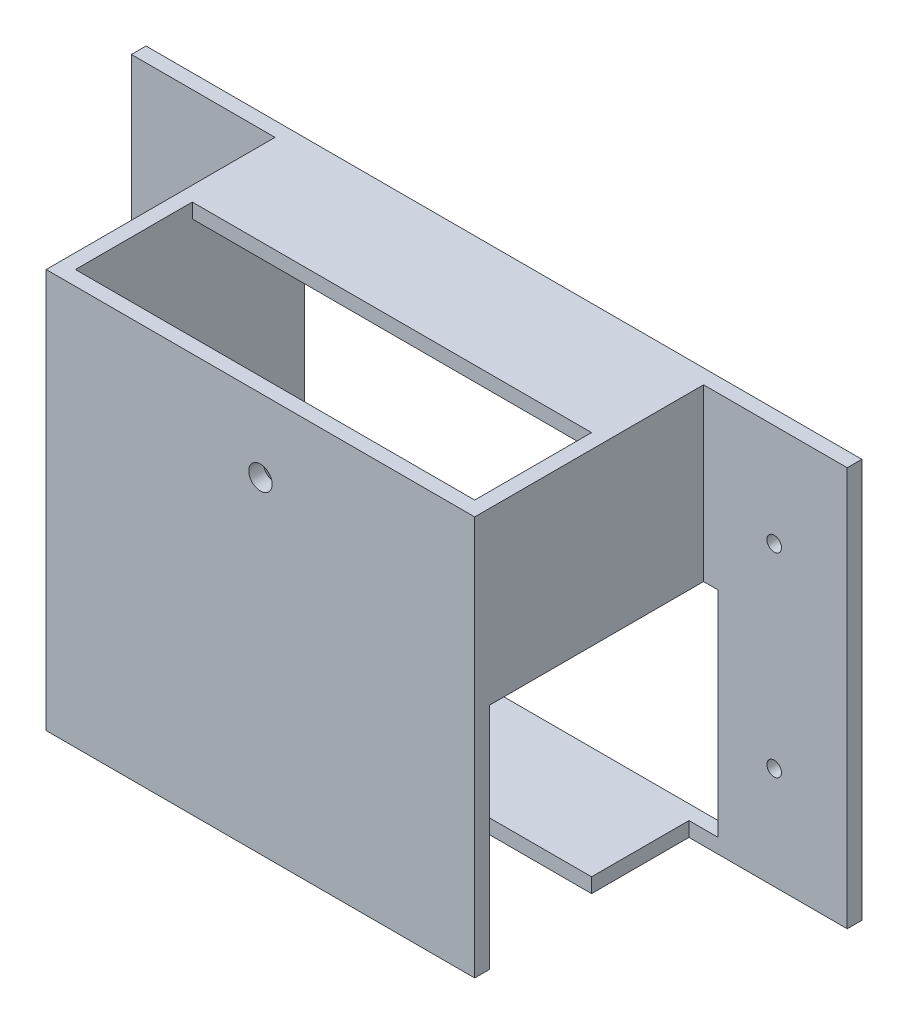
ISO-10303-21;
HEADER;
FILE_DESCRIPTION(('STEP AP214'),'2;1');
FILE_NAME('part.step','',(''),(''),'','','');
FILE_SCHEMA(('AUTOMOTIVE_DESIGN { 1 0 10303 214 1 1 1 1 }'));
ENDSEC;
DATA;
#1=APPLICATION_CONTEXT('core data for automotive mechanical design processes');
#2=APPLICATION_PROTOCOL_DEFINITION('international standard','automotive_design',2000,#1);
#3=PRODUCT_CONTEXT('',#1,'mechanical');
#4=PRODUCT('Part','Part','',(#3));
#5=PRODUCT_RELATED_PRODUCT_CATEGORY('part','',(#4));
#6=PRODUCT_DEFINITION_FORMATION('','',#4);
#7=PRODUCT_DEFINITION_CONTEXT('part definition',#1,'design');
#8=PRODUCT_DEFINITION('design','',#6,#7);
#9=PRODUCT_DEFINITION_SHAPE('','',#8);
#10=(LENGTH_UNIT() NAMED_UNIT(*) SI_UNIT(.MILLI.,.METRE.));
#11=(NAMED_UNIT(*) PLANE_ANGLE_UNIT() SI_UNIT($,.RADIAN.));
#12=(NAMED_UNIT(*) SI_UNIT($,.STERADIAN.) SOLID_ANGLE_UNIT());
#13=UNCERTAINTY_MEASURE_WITH_UNIT(LENGTH_MEASURE(1.E-05),#10,'distance_accuracy_value','');
#14=(GEOMETRIC_REPRESENTATION_CONTEXT(3) GLOBAL_UNCERTAINTY_ASSIGNED_CONTEXT((#13)) GLOBAL_UNIT_ASSIGNED_CONTEXT((#10,
#11,#12)) REPRESENTATION_CONTEXT('',''));
#15=CARTESIAN_POINT('',(0.,0.,0.));
#16=DIRECTION('',(0.,0.,1.));
#17=DIRECTION('',(1.,0.,0.));
#18=AXIS2_PLACEMENT_3D('',#15,#16,#17);
#19=CARTESIAN_POINT('',(68.5398773006135,39.0046012269939,50.));
#20=DIRECTION('',(-1.,0.,0.));
#21=DIRECTION('',(0.,-1.,0.));
#22=AXIS2_PLACEMENT_3D('',#19,#20,#21);
#23=PLANE('',#22);
#24=DIRECTION('',(0.,1.,0.));
#25=VECTOR('',#24,1.);
#26=CARTESIAN_POINT('',(68.5398773006136,-42.9953987730062,3.00000000000002));
#27=LINE('',#26,#25);
#28=CARTESIAN_POINT('',(68.5398773006136,-42.9953987730062,3.00000000000002));
#29=VERTEX_POINT('',#28);
#30=CARTESIAN_POINT('',(68.5398773006136,39.0046012269939,3.00000000000002));
#31=VERTEX_POINT('',#30);
#32=EDGE_CURVE('E209',#29,#31,#27,.T.);
#33=ORIENTED_EDGE('',*,*,#32,.F.);
#34=DIRECTION('',(0.,0.,-1.));
#35=VECTOR('',#34,1.);
#36=CARTESIAN_POINT('',(68.5398773006136,-42.9953987730062,50.));
#37=LINE('',#36,#35);
#38=CARTESIAN_POINT('',(68.5398773006136,-42.9953987730062,0.));
#39=VERTEX_POINT('',#38);
#40=EDGE_CURVE('E264',#29,#39,#37,.T.);
#41=ORIENTED_EDGE('',*,*,#40,.T.);
#42=DIRECTION('',(0.,1.,0.));
#43=VECTOR('',#42,1.);
#44=CARTESIAN_POINT('',(68.5398773006135,39.0046012269939,0.));
#45=LINE('',#44,#43);
#46=CARTESIAN_POINT('',(68.5398773006135,39.0046012269939,0.));
#47=VERTEX_POINT('',#46);
#48=EDGE_CURVE('E256',#39,#47,#45,.T.);
#49=ORIENTED_EDGE('',*,*,#48,.T.);
#50=DIRECTION('',(0.,0.,-1.));
#51=VECTOR('',#50,1.);
#52=CARTESIAN_POINT('',(68.5398773006135,39.0046012269939,50.));
#53=LINE('',#52,#51);
#54=EDGE_CURVE('E262',#31,#47,#53,.T.);
#55=ORIENTED_EDGE('',*,*,#54,.F.);
#56=EDGE_LOOP('',(#33,#41,#49,#55));
#57=FACE_BOUND('',#56,.T.);
#58=ADVANCED_FACE('F33',(#57),#23,.F.);
#59=CARTESIAN_POINT('',(-78.4601226993865,39.0046012269939,50.));
#60=DIRECTION('',(1.,0.,0.));
#61=DIRECTION('',(0.,1.,0.));
#62=AXIS2_PLACEMENT_3D('',#59,#60,#61);
#63=PLANE('',#62);
#64=DIRECTION('',(0.,-1.,0.));
#65=VECTOR('',#64,1.);
#66=CARTESIAN_POINT('',(-78.4601226993865,39.0046012269939,3.00000000000002));
#67=LINE('',#66,#65);
#68=CARTESIAN_POINT('',(-78.4601226993865,39.0046012269939,3.00000000000002));
#69=VERTEX_POINT('',#68);
#70=CARTESIAN_POINT('',(-78.4601226993865,-42.9953987730062,3.00000000000002));
#71=VERTEX_POINT('',#70);
#72=EDGE_CURVE('E226',#69,#71,#67,.T.);
#73=ORIENTED_EDGE('',*,*,#72,.F.);
#74=DIRECTION('',(0.,0.,-1.));
#75=VECTOR('',#74,1.);
#76=CARTESIAN_POINT('',(-78.4601226993865,39.0046012269939,50.));
#77=LINE('',#76,#75);
#78=CARTESIAN_POINT('',(-78.4601226993865,39.0046012269939,0.));
#79=VERTEX_POINT('',#78);
#80=EDGE_CURVE('E250',#69,#79,#77,.T.);
#81=ORIENTED_EDGE('',*,*,#80,.T.);
#82=DIRECTION('',(0.,-1.,0.));
#83=VECTOR('',#82,1.);
#84=CARTESIAN_POINT('',(-78.4601226993865,39.0046012269939,0.));
#85=LINE('',#84,#83);
#86=CARTESIAN_POINT('',(-78.4601226993864,-42.9953987730062,0.));
#87=VERTEX_POINT('',#86);
#88=EDGE_CURVE('E242',#79,#87,#85,.T.);
#89=ORIENTED_EDGE('',*,*,#88,.T.);
#90=DIRECTION('',(0.,0.,-1.));
#91=VECTOR('',#90,1.);
#92=CARTESIAN_POINT('',(-78.4601226993864,-42.9953987730062,50.));
#93=LINE('',#92,#91);
#94=EDGE_CURVE('E41',#71,#87,#93,.T.);
#95=ORIENTED_EDGE('',*,*,#94,.F.);
#96=EDGE_LOOP('',(#73,#81,#89,#95));
#97=FACE_BOUND('',#96,.T.);
#98=ADVANCED_FACE('F35',(#97),#63,.F.);
#99=CARTESIAN_POINT('',(-78.4601226993864,-42.9953987730062,50.));
#100=DIRECTION('',(0.,1.,0.));
#101=DIRECTION('',(0.,0.,1.));
#102=AXIS2_PLACEMENT_3D('',#99,#100,#101);
#103=PLANE('',#102);
#104=DIRECTION('',(1.,0.,0.));
#105=VECTOR('',#104,1.);
#106=CARTESIAN_POINT('',(-78.4601226993864,-42.9953987730062,47.));
#107=LINE('',#106,#105);
#108=CARTESIAN_POINT('',(-45.9601226993865,-42.9953987730062,47.));
#109=VERTEX_POINT('',#108);
#110=CARTESIAN_POINT('',(39.0398773006136,-42.9953987730062,47.));
#111=VERTEX_POINT('',#110);
#112=EDGE_CURVE('E308',#109,#111,#107,.T.);
#113=ORIENTED_EDGE('',*,*,#112,.T.);
#114=DIRECTION('',(0.,0.,1.));
#115=VECTOR('',#114,1.);
#116=CARTESIAN_POINT('',(39.0398773006136,-42.9953987730062,3.00000000000002));
#117=LINE('',#116,#115);
#118=CARTESIAN_POINT('',(39.0398773006136,-42.9953987730062,50.));
#119=VERTEX_POINT('',#118);
#120=EDGE_CURVE('E222',#111,#119,#117,.T.);
#121=ORIENTED_EDGE('',*,*,#120,.T.);
#122=DIRECTION('',(1.,0.,0.));
#123=VECTOR('',#122,1.);
#124=CARTESIAN_POINT('',(-78.4601226993864,-42.9953987730062,50.));
#125=LINE('',#124,#123);
#126=CARTESIAN_POINT('',(-48.9601226993865,-42.9953987730062,50.));
#127=VERTEX_POINT('',#126);
#128=EDGE_CURVE('E244',#127,#119,#125,.T.);
#129=ORIENTED_EDGE('',*,*,#128,.F.);
#130=DIRECTION('',(0.,0.,1.));
#131=VECTOR('',#130,1.);
#132=CARTESIAN_POINT('',(-48.9601226993864,-42.9953987730062,3.00000000000002));
#133=LINE('',#132,#131);
#134=CARTESIAN_POINT('',(-48.9601226993864,-42.9953987730062,3.00000000000002));
#135=VERTEX_POINT('',#134);
#136=EDGE_CURVE('E236',#135,#127,#133,.T.);
#137=ORIENTED_EDGE('',*,*,#136,.F.);
#138=DIRECTION('',(1.,0.,0.));
#139=VECTOR('',#138,1.);
#140=CARTESIAN_POINT('',(-78.4601226993865,-42.9953987730062,3.00000000000002));
#141=LINE('',#140,#139);
#142=EDGE_CURVE('E228',#71,#135,#141,.T.);
#143=ORIENTED_EDGE('',*,*,#142,.F.);
#144=ORIENTED_EDGE('',*,*,#94,.T.);
#145=DIRECTION('',(1.,0.,0.));
#146=VECTOR('',#145,1.);
#147=CARTESIAN_POINT('',(-78.4601226993864,-42.9953987730062,0.));
#148=LINE('',#147,#146);
#149=EDGE_CURVE('E253',#87,#39,#148,.T.);
#150=ORIENTED_EDGE('',*,*,#149,.T.);
#151=ORIENTED_EDGE('',*,*,#40,.F.);
#152=DIRECTION('',(1.,0.,0.));
#153=VECTOR('',#152,1.);
#154=CARTESIAN_POINT('',(68.5398773006136,-42.9953987730062,3.00000000000002));
#155=LINE('',#154,#153);
#156=CARTESIAN_POINT('',(36.0398773006136,-42.9953987730062,3.00000000000002));
#157=VERTEX_POINT('',#156);
#158=EDGE_CURVE('E217',#157,#29,#155,.T.);
#159=ORIENTED_EDGE('',*,*,#158,.F.);
#160=DIRECTION('',(0.,0.,-1.));
#161=VECTOR('',#160,1.);
#162=CARTESIAN_POINT('',(36.0398773006136,-42.9953987730062,47.));
#163=LINE('',#162,#161);
#164=CARTESIAN_POINT('',(36.0398773006136,-42.9953987730062,23.));
#165=VERTEX_POINT('',#164);
#166=EDGE_CURVE('E191',#165,#157,#163,.T.);
#167=ORIENTED_EDGE('',*,*,#166,.F.);
#168=DIRECTION('',(-1.,0.,0.));
#169=VECTOR('',#168,1.);
#170=CARTESIAN_POINT('',(-78.4601226993864,-42.9953987730062,23.));
#171=LINE('',#170,#169);
#172=CARTESIAN_POINT('',(-45.9601226993865,-42.9953987730062,23.));
#173=VERTEX_POINT('',#172);
#174=EDGE_CURVE('E276',#165,#173,#171,.T.);
#175=ORIENTED_EDGE('',*,*,#174,.T.);
#176=DIRECTION('',(0.,0.,1.));
#177=VECTOR('',#176,1.);
#178=CARTESIAN_POINT('',(-45.9601226993865,-42.9953987730062,50.));
#179=LINE('',#178,#177);
#180=EDGE_CURVE('E307',#173,#109,#179,.T.);
#181=ORIENTED_EDGE('',*,*,#180,.T.);
#182=EDGE_LOOP('',(#113,#121,#129,#137,#143,#144,#150,#151,#159,#167,#175,#181));
#183=FACE_BOUND('',#182,.T.);
#184=ADVANCED_FACE('F320',(#183),#103,.F.);
#185=CARTESIAN_POINT('',(-78.4601226993865,39.0046012269939,50.));
#186=DIRECTION('',(0.,-1.,0.));
#187=DIRECTION('',(0.,0.,-1.));
#188=AXIS2_PLACEMENT_3D('',#185,#186,#187);
#189=PLANE('',#188);
#190=DIRECTION('',(-1.,0.,0.));
#191=VECTOR('',#190,1.);
#192=CARTESIAN_POINT('',(36.0398773006135,39.0046012269939,23.));
#193=LINE('',#192,#191);
#194=CARTESIAN_POINT('',(36.0398773006135,39.0046012269939,23.));
#195=VERTEX_POINT('',#194);
#196=CARTESIAN_POINT('',(-45.9601226993865,39.0046012269939,23.));
#197=VERTEX_POINT('',#196);
#198=EDGE_CURVE('E363',#195,#197,#193,.T.);
#199=ORIENTED_EDGE('',*,*,#198,.F.);
#200=DIRECTION('',(0.,0.,-1.));
#201=VECTOR('',#200,1.);
#202=CARTESIAN_POINT('',(36.0398773006135,39.0046012269939,47.));
#203=LINE('',#202,#201);
#204=CARTESIAN_POINT('',(36.0398773006135,39.0046012269939,47.));
#205=VERTEX_POINT('',#204);
#206=EDGE_CURVE('E56',#205,#195,#203,.T.);
#207=ORIENTED_EDGE('',*,*,#206,.F.);
#208=DIRECTION('',(1.,0.,0.));
#209=VECTOR('',#208,1.);
#210=CARTESIAN_POINT('',(36.0398773006135,39.0046012269939,47.));
#211=LINE('',#210,#209);
#212=CARTESIAN_POINT('',(-45.9601226993865,39.0046012269939,47.));
#213=VERTEX_POINT('',#212);
#214=EDGE_CURVE('E315',#213,#205,#211,.T.);
#215=ORIENTED_EDGE('',*,*,#214,.F.);
#216=DIRECTION('',(0.,0.,1.));
#217=VECTOR('',#216,1.);
#218=CARTESIAN_POINT('',(-45.9601226993865,39.0046012269939,47.));
#219=LINE('',#218,#217);
#220=EDGE_CURVE('E453',#197,#213,#219,.T.);
#221=ORIENTED_EDGE('',*,*,#220,.F.);
#222=EDGE_LOOP('',(#199,#207,#215,#221));
#223=FACE_BOUND('',#222,.T.);
#224=DIRECTION('',(-1.,0.,0.));
#225=VECTOR('',#224,1.);
#226=CARTESIAN_POINT('',(-78.4601226993865,39.0046012269939,50.));
#227=LINE('',#226,#225);
#228=CARTESIAN_POINT('',(39.0398773006136,39.0046012269939,50.));
#229=VERTEX_POINT('',#228);
#230=CARTESIAN_POINT('',(-48.9601226993865,39.0046012269939,50.));
#231=VERTEX_POINT('',#230);
#232=EDGE_CURVE('E247',#229,#231,#227,.T.);
#233=ORIENTED_EDGE('',*,*,#232,.F.);
#234=DIRECTION('',(0.,0.,1.));
#235=VECTOR('',#234,1.);
#236=CARTESIAN_POINT('',(39.0398773006136,39.0046012269939,3.00000000000002));
#237=LINE('',#236,#235);
#238=CARTESIAN_POINT('',(39.0398773006136,39.0046012269939,3.00000000000002));
#239=VERTEX_POINT('',#238);
#240=EDGE_CURVE('E219',#239,#229,#237,.T.);
#241=ORIENTED_EDGE('',*,*,#240,.F.);
#242=DIRECTION('',(-1.,0.,0.));
#243=VECTOR('',#242,1.);
#244=CARTESIAN_POINT('',(68.5398773006136,39.0046012269939,3.00000000000002));
#245=LINE('',#244,#243);
#246=EDGE_CURVE('E211',#31,#239,#245,.T.);
#247=ORIENTED_EDGE('',*,*,#246,.F.);
#248=ORIENTED_EDGE('',*,*,#54,.T.);
#249=DIRECTION('',(-1.,0.,0.));
#250=VECTOR('',#249,1.);
#251=CARTESIAN_POINT('',(-78.4601226993865,39.0046012269939,0.));
#252=LINE('',#251,#250);
#253=EDGE_CURVE('E248',#47,#79,#252,.T.);
#254=ORIENTED_EDGE('',*,*,#253,.T.);
#255=ORIENTED_EDGE('',*,*,#80,.F.);
#256=DIRECTION('',(-1.,0.,0.));
#257=VECTOR('',#256,1.);
#258=CARTESIAN_POINT('',(-78.4601226993865,39.0046012269939,3.00000000000002));
#259=LINE('',#258,#257);
#260=CARTESIAN_POINT('',(-48.9601226993865,39.0046012269939,3.00000000000002));
#261=VERTEX_POINT('',#260);
#262=EDGE_CURVE('E234',#261,#69,#259,.T.);
#263=ORIENTED_EDGE('',*,*,#262,.F.);
#264=DIRECTION('',(0.,0.,1.));
#265=VECTOR('',#264,1.);
#266=CARTESIAN_POINT('',(-48.9601226993865,39.0046012269939,3.00000000000002));
#267=LINE('',#266,#265);
#268=EDGE_CURVE('E239',#261,#231,#267,.T.);
#269=ORIENTED_EDGE('',*,*,#268,.T.);
#270=EDGE_LOOP('',(#233,#241,#247,#248,#254,#255,#263,#269));
#271=FACE_BOUND('',#270,.T.);
#272=ADVANCED_FACE('F346',(#223,#271),#189,.F.);
#273=CARTESIAN_POINT('',(0.,0.,50.));
#274=DIRECTION('',(0.,0.,1.));
#275=DIRECTION('',(1.,0.,0.));
#276=AXIS2_PLACEMENT_3D('',#273,#274,#275);
#277=PLANE('',#276);
#278=CARTESIAN_POINT('',(-4.96012269938646,24.0046012269939,50.));
#279=DIRECTION('',(0.,0.,1.));
#280=DIRECTION('',(1.,0.,0.));
#281=AXIS2_PLACEMENT_3D('',#278,#279,#280);
#282=CIRCLE('',#281,2.4);
#283=CARTESIAN_POINT('',(-2.56012269938646,24.0046012269939,50.));
#284=VERTEX_POINT('',#283);
#285=EDGE_CURVE('E269',#284,#284,#282,.T.);
#286=ORIENTED_EDGE('',*,*,#285,.F.);
#287=EDGE_LOOP('',(#286));
#288=FACE_BOUND('',#287,.T.);
#289=DIRECTION('',(0.,-1.,0.));
#290=VECTOR('',#289,1.);
#291=CARTESIAN_POINT('',(39.0398773006136,-42.9953987730062,50.));
#292=LINE('',#291,#290);
#293=EDGE_CURVE('E201',#229,#119,#292,.T.);
#294=ORIENTED_EDGE('',*,*,#293,.F.);
#295=ORIENTED_EDGE('',*,*,#232,.T.);
#296=DIRECTION('',(0.,1.,0.));
#297=VECTOR('',#296,1.);
#298=CARTESIAN_POINT('',(-48.9601226993865,39.0046012269939,50.));
#299=LINE('',#298,#297);
#300=EDGE_CURVE('E224',#127,#231,#299,.T.);
#301=ORIENTED_EDGE('',*,*,#300,.F.);
#302=ORIENTED_EDGE('',*,*,#128,.T.);
#303=EDGE_LOOP('',(#294,#295,#301,#302));
#304=FACE_BOUND('',#303,.T.);
#305=ADVANCED_FACE('F352',(#288,#304),#277,.T.);
#306=CARTESIAN_POINT('',(0.,0.,0.));
#307=DIRECTION('',(0.,0.,1.));
#308=DIRECTION('',(1.,0.,0.));
#309=AXIS2_PLACEMENT_3D('',#306,#307,#308);
#310=PLANE('',#309);
#311=CARTESIAN_POINT('',(-63.4601226993865,-21.9953987730061,0.));
#312=DIRECTION('',(0.,0.,-1.));
#313=DIRECTION('',(-1.,0.,0.));
#314=AXIS2_PLACEMENT_3D('',#311,#312,#313);
#315=CIRCLE('',#314,1.5);
#316=CARTESIAN_POINT('',(-64.9601226993865,-21.9953987730061,0.));
#317=VERTEX_POINT('',#316);
#318=EDGE_CURVE('E413',#317,#317,#315,.T.);
#319=ORIENTED_EDGE('',*,*,#318,.F.);
#320=EDGE_LOOP('',(#319));
#321=FACE_BOUND('',#320,.T.);
#322=CARTESIAN_POINT('',(53.5398773006136,18.0046012269939,0.));
#323=DIRECTION('',(0.,0.,-1.));
#324=DIRECTION('',(-1.,0.,0.));
#325=AXIS2_PLACEMENT_3D('',#322,#323,#324);
#326=CIRCLE('',#325,1.5);
#327=CARTESIAN_POINT('',(52.0398773006136,18.0046012269939,0.));
#328=VERTEX_POINT('',#327);
#329=EDGE_CURVE('E417',#328,#328,#326,.T.);
#330=ORIENTED_EDGE('',*,*,#329,.F.);
#331=EDGE_LOOP('',(#330));
#332=FACE_BOUND('',#331,.T.);
#333=CARTESIAN_POINT('',(53.5398773006136,-21.9953987730061,0.));
#334=DIRECTION('',(0.,0.,-1.));
#335=DIRECTION('',(-1.,0.,0.));
#336=AXIS2_PLACEMENT_3D('',#333,#334,#335);
#337=CIRCLE('',#336,1.5);
#338=CARTESIAN_POINT('',(52.0398773006136,-21.9953987730061,0.));
#339=VERTEX_POINT('',#338);
#340=EDGE_CURVE('E421',#339,#339,#337,.T.);
#341=ORIENTED_EDGE('',*,*,#340,.F.);
#342=EDGE_LOOP('',(#341));
#343=FACE_BOUND('',#342,.T.);
#344=CARTESIAN_POINT('',(-63.4601226993864,18.0046012269939,0.));
#345=DIRECTION('',(0.,0.,-1.));
#346=DIRECTION('',(-1.,0.,0.));
#347=AXIS2_PLACEMENT_3D('',#344,#345,#346);
#348=CIRCLE('',#347,1.5);
#349=CARTESIAN_POINT('',(-64.9601226993864,18.0046012269939,0.));
#350=VERTEX_POINT('',#349);
#351=EDGE_CURVE('E424',#350,#350,#348,.T.);
#352=ORIENTED_EDGE('',*,*,#351,.F.);
#353=EDGE_LOOP('',(#352));
#354=FACE_BOUND('',#353,.T.);
#355=DIRECTION('',(0.,1.,0.));
#356=VECTOR('',#355,1.);
#357=CARTESIAN_POINT('',(42.0398773006136,0.,0.));
#358=LINE('',#357,#356);
#359=CARTESIAN_POINT('',(42.0398773006136,-39.9953987730062,0.));
#360=VERTEX_POINT('',#359);
#361=CARTESIAN_POINT('',(42.0398773006136,4.00460122699385,0.));
#362=VERTEX_POINT('',#361);
#363=EDGE_CURVE('E442',#360,#362,#358,.T.);
#364=ORIENTED_EDGE('',*,*,#363,.T.);
#365=DIRECTION('',(-1.,0.,0.));
#366=VECTOR('',#365,1.);
#367=CARTESIAN_POINT('',(0.,4.00460122699385,0.));
#368=LINE('',#367,#366);
#369=CARTESIAN_POINT('',(36.0398773006136,4.00460122699385,0.));
#370=VERTEX_POINT('',#369);
#371=EDGE_CURVE('E438',#362,#370,#368,.T.);
#372=ORIENTED_EDGE('',*,*,#371,.T.);
#373=DIRECTION('',(0.,-1.,0.));
#374=VECTOR('',#373,1.);
#375=CARTESIAN_POINT('',(36.0398773006136,-39.9953987730062,0.));
#376=LINE('',#375,#374);
#377=CARTESIAN_POINT('',(36.0398773006136,36.0046012269938,0.));
#378=VERTEX_POINT('',#377);
#379=EDGE_CURVE('E291',#378,#370,#376,.T.);
#380=ORIENTED_EDGE('',*,*,#379,.F.);
#381=DIRECTION('',(1.,0.,0.));
#382=VECTOR('',#381,1.);
#383=CARTESIAN_POINT('',(-45.9601226993864,36.0046012269938,0.));
#384=LINE('',#383,#382);
#385=CARTESIAN_POINT('',(-45.9601226993864,36.0046012269938,0.));
#386=VERTEX_POINT('',#385);
#387=EDGE_CURVE('E273',#386,#378,#384,.T.);
#388=ORIENTED_EDGE('',*,*,#387,.F.);
#389=DIRECTION('',(0.,1.,0.));
#390=VECTOR('',#389,1.);
#391=CARTESIAN_POINT('',(-45.9601226993865,-39.9953987730061,0.));
#392=LINE('',#391,#390);
#393=CARTESIAN_POINT('',(-45.9601226993865,-39.9953987730061,0.));
#394=VERTEX_POINT('',#393);
#395=EDGE_CURVE('E268',#394,#386,#392,.T.);
#396=ORIENTED_EDGE('',*,*,#395,.F.);
#397=DIRECTION('',(-1.,0.,0.));
#398=VECTOR('',#397,1.);
#399=CARTESIAN_POINT('',(-45.9601226993865,-39.9953987730061,0.));
#400=LINE('',#399,#398);
#401=EDGE_CURVE('E286',#360,#394,#400,.T.);
#402=ORIENTED_EDGE('',*,*,#401,.F.);
#403=EDGE_LOOP('',(#364,#372,#380,#388,#396,#402));
#404=FACE_BOUND('',#403,.T.);
#405=ORIENTED_EDGE('',*,*,#88,.F.);
#406=ORIENTED_EDGE('',*,*,#253,.F.);
#407=ORIENTED_EDGE('',*,*,#48,.F.);
#408=ORIENTED_EDGE('',*,*,#149,.F.);
#409=EDGE_LOOP('',(#405,#406,#407,#408));
#410=FACE_BOUND('',#409,.T.);
#411=ADVANCED_FACE('F300',(#321,#332,#343,#354,#404,#410),#310,.F.);
#412=CARTESIAN_POINT('',(-48.9601226993865,39.0046012269939,3.00000000000002));
#413=DIRECTION('',(1.,0.,0.));
#414=DIRECTION('',(0.,1.,0.));
#415=AXIS2_PLACEMENT_3D('',#412,#413,#414);
#416=PLANE('',#415);
#417=ORIENTED_EDGE('',*,*,#300,.T.);
#418=ORIENTED_EDGE('',*,*,#268,.F.);
#419=DIRECTION('',(0.,1.,0.));
#420=VECTOR('',#419,1.);
#421=CARTESIAN_POINT('',(-48.9601226993865,39.0046012269939,3.00000000000002));
#422=LINE('',#421,#420);
#423=EDGE_CURVE('E231',#135,#261,#422,.T.);
#424=ORIENTED_EDGE('',*,*,#423,.F.);
#425=ORIENTED_EDGE('',*,*,#136,.T.);
#426=EDGE_LOOP('',(#417,#418,#424,#425));
#427=FACE_BOUND('',#426,.T.);
#428=ADVANCED_FACE('F373',(#427),#416,.F.);
#429=CARTESIAN_POINT('',(0.,0.,3.00000000000002));
#430=DIRECTION('',(0.,0.,1.));
#431=DIRECTION('',(1.,0.,0.));
#432=AXIS2_PLACEMENT_3D('',#429,#430,#431);
#433=PLANE('',#432);
#434=CARTESIAN_POINT('',(-63.4601226993865,-21.9953987730061,3.));
#435=DIRECTION('',(0.,0.,-1.));
#436=DIRECTION('',(-1.,0.,0.));
#437=AXIS2_PLACEMENT_3D('',#434,#435,#436);
#438=CIRCLE('',#437,1.5);
#439=CARTESIAN_POINT('',(-64.9601226993865,-21.9953987730061,3.));
#440=VERTEX_POINT('',#439);
#441=EDGE_CURVE('E426',#440,#440,#438,.T.);
#442=ORIENTED_EDGE('',*,*,#441,.T.);
#443=EDGE_LOOP('',(#442));
#444=FACE_BOUND('',#443,.T.);
#445=CARTESIAN_POINT('',(-63.4601226993864,18.0046012269939,3.));
#446=DIRECTION('',(0.,0.,-1.));
#447=DIRECTION('',(-1.,0.,0.));
#448=AXIS2_PLACEMENT_3D('',#445,#446,#447);
#449=CIRCLE('',#448,1.5);
#450=CARTESIAN_POINT('',(-64.9601226993864,18.0046012269939,3.));
#451=VERTEX_POINT('',#450);
#452=EDGE_CURVE('E183',#451,#451,#449,.T.);
#453=ORIENTED_EDGE('',*,*,#452,.T.);
#454=EDGE_LOOP('',(#453));
#455=FACE_BOUND('',#454,.T.);
#456=ORIENTED_EDGE('',*,*,#72,.T.);
#457=ORIENTED_EDGE('',*,*,#142,.T.);
#458=ORIENTED_EDGE('',*,*,#423,.T.);
#459=ORIENTED_EDGE('',*,*,#262,.T.);
#460=EDGE_LOOP('',(#456,#457,#458,#459));
#461=FACE_BOUND('',#460,.T.);
#462=ADVANCED_FACE('F393',(#444,#455,#461),#433,.T.);
#463=CARTESIAN_POINT('',(39.0398773006136,-42.9953987730062,3.00000000000002));
#464=DIRECTION('',(-1.,0.,0.));
#465=DIRECTION('',(0.,0.,1.));
#466=AXIS2_PLACEMENT_3D('',#463,#464,#465);
#467=PLANE('',#466);
#468=ORIENTED_EDGE('',*,*,#120,.F.);
#469=DIRECTION('',(0.,-1.,0.));
#470=VECTOR('',#469,1.);
#471=CARTESIAN_POINT('',(39.0398773006136,-42.9953987730062,47.));
#472=LINE('',#471,#470);
#473=CARTESIAN_POINT('',(39.0398773006136,4.00460122699385,47.));
#474=VERTEX_POINT('',#473);
#475=EDGE_CURVE('E444',#474,#111,#472,.T.);
#476=ORIENTED_EDGE('',*,*,#475,.F.);
#477=DIRECTION('',(0.,0.,1.));
#478=VECTOR('',#477,1.);
#479=CARTESIAN_POINT('',(39.0398773006136,4.00460122699385,47.));
#480=LINE('',#479,#478);
#481=CARTESIAN_POINT('',(39.0398773006136,4.00460122699385,3.00000000000002));
#482=VERTEX_POINT('',#481);
#483=EDGE_CURVE('E383',#482,#474,#480,.T.);
#484=ORIENTED_EDGE('',*,*,#483,.F.);
#485=DIRECTION('',(0.,-1.,0.));
#486=VECTOR('',#485,1.);
#487=CARTESIAN_POINT('',(39.0398773006136,-42.9953987730062,3.00000000000002));
#488=LINE('',#487,#486);
#489=EDGE_CURVE('E214',#239,#482,#488,.T.);
#490=ORIENTED_EDGE('',*,*,#489,.F.);
#491=ORIENTED_EDGE('',*,*,#240,.T.);
#492=ORIENTED_EDGE('',*,*,#293,.T.);
#493=EDGE_LOOP('',(#468,#476,#484,#490,#491,#492));
#494=FACE_BOUND('',#493,.T.);
#495=ADVANCED_FACE('F380',(#494),#467,.F.);
#496=CARTESIAN_POINT('',(0.,0.,3.00000000000002));
#497=DIRECTION('',(0.,0.,1.));
#498=DIRECTION('',(1.,0.,0.));
#499=AXIS2_PLACEMENT_3D('',#496,#497,#498);
#500=PLANE('',#499);
#501=CARTESIAN_POINT('',(53.5398773006136,18.0046012269939,3.));
#502=DIRECTION('',(0.,0.,-1.));
#503=DIRECTION('',(-1.,0.,0.));
#504=AXIS2_PLACEMENT_3D('',#501,#502,#503);
#505=CIRCLE('',#504,1.5);
#506=CARTESIAN_POINT('',(52.0398773006136,18.0046012269939,3.));
#507=VERTEX_POINT('',#506);
#508=EDGE_CURVE('E486',#507,#507,#505,.T.);
#509=ORIENTED_EDGE('',*,*,#508,.T.);
#510=EDGE_LOOP('',(#509));
#511=FACE_BOUND('',#510,.T.);
#512=CARTESIAN_POINT('',(53.5398773006136,-21.9953987730061,3.));
#513=DIRECTION('',(0.,0.,-1.));
#514=DIRECTION('',(-1.,0.,0.));
#515=AXIS2_PLACEMENT_3D('',#512,#513,#514);
#516=CIRCLE('',#515,1.5);
#517=CARTESIAN_POINT('',(52.0398773006136,-21.9953987730061,3.));
#518=VERTEX_POINT('',#517);
#519=EDGE_CURVE('E489',#518,#518,#516,.T.);
#520=ORIENTED_EDGE('',*,*,#519,.T.);
#521=EDGE_LOOP('',(#520));
#522=FACE_BOUND('',#521,.T.);
#523=DIRECTION('',(-1.,0.,0.));
#524=VECTOR('',#523,1.);
#525=CARTESIAN_POINT('',(36.0398773006136,4.00460122699385,3.00000000000002));
#526=LINE('',#525,#524);
#527=CARTESIAN_POINT('',(42.0398773006136,4.00460122699385,3.00000000000002));
#528=VERTEX_POINT('',#527);
#529=EDGE_CURVE('E434',#528,#482,#526,.T.);
#530=ORIENTED_EDGE('',*,*,#529,.F.);
#531=DIRECTION('',(0.,1.,0.));
#532=VECTOR('',#531,1.);
#533=CARTESIAN_POINT('',(42.0398773006136,4.00460122699385,3.00000000000002));
#534=LINE('',#533,#532);
#535=CARTESIAN_POINT('',(42.0398773006136,-39.9953987730062,3.00000000000002));
#536=VERTEX_POINT('',#535);
#537=EDGE_CURVE('E179',#536,#528,#534,.T.);
#538=ORIENTED_EDGE('',*,*,#537,.F.);
#539=DIRECTION('',(1.,0.,0.));
#540=VECTOR('',#539,1.);
#541=CARTESIAN_POINT('',(36.0398773006136,-39.9953987730062,3.00000000000002));
#542=LINE('',#541,#540);
#543=CARTESIAN_POINT('',(36.0398773006136,-39.9953987730062,3.00000000000002));
#544=VERTEX_POINT('',#543);
#545=EDGE_CURVE('E173',#544,#536,#542,.T.);
#546=ORIENTED_EDGE('',*,*,#545,.F.);
#547=DIRECTION('',(0.,1.,0.));
#548=VECTOR('',#547,1.);
#549=CARTESIAN_POINT('',(36.0398773006136,-42.9953987730062,3.00000000000002));
#550=LINE('',#549,#548);
#551=EDGE_CURVE('E177',#157,#544,#550,.T.);
#552=ORIENTED_EDGE('',*,*,#551,.F.);
#553=ORIENTED_EDGE('',*,*,#158,.T.);
#554=ORIENTED_EDGE('',*,*,#32,.T.);
#555=ORIENTED_EDGE('',*,*,#246,.T.);
#556=ORIENTED_EDGE('',*,*,#489,.T.);
#557=EDGE_LOOP('',(#530,#538,#546,#552,#553,#554,#555,#556));
#558=FACE_BOUND('',#557,.T.);
#559=ADVANCED_FACE('F176',(#511,#522,#558),#500,.T.);
#560=CARTESIAN_POINT('',(-45.9601226993865,-39.9953987730061,47.));
#561=DIRECTION('',(-1.,0.,0.));
#562=DIRECTION('',(0.,-1.,0.));
#563=AXIS2_PLACEMENT_3D('',#560,#561,#562);
#564=PLANE('',#563);
#565=DIRECTION('',(0.,0.,-1.));
#566=VECTOR('',#565,1.);
#567=CARTESIAN_POINT('',(-45.9601226993864,36.0046012269938,47.));
#568=LINE('',#567,#566);
#569=CARTESIAN_POINT('',(-45.9601226993864,36.0046012269938,23.));
#570=VERTEX_POINT('',#569);
#571=EDGE_CURVE('E203',#570,#386,#568,.T.);
#572=ORIENTED_EDGE('',*,*,#571,.F.);
#573=DIRECTION('',(0.,1.,0.));
#574=VECTOR('',#573,1.);
#575=CARTESIAN_POINT('',(-45.9601226993865,-44.9953987730062,23.));
#576=LINE('',#575,#574);
#577=EDGE_CURVE('E309',#570,#197,#576,.T.);
#578=ORIENTED_EDGE('',*,*,#577,.T.);
#579=ORIENTED_EDGE('',*,*,#220,.T.);
#580=DIRECTION('',(0.,1.,0.));
#581=VECTOR('',#580,1.);
#582=CARTESIAN_POINT('',(-45.9601226993865,-39.9953987730061,47.));
#583=LINE('',#582,#581);
#584=EDGE_CURVE('E284',#109,#213,#583,.T.);
#585=ORIENTED_EDGE('',*,*,#584,.F.);
#586=ORIENTED_EDGE('',*,*,#180,.F.);
#587=CARTESIAN_POINT('',(-45.9601226993865,-39.9953987730061,23.));
#588=VERTEX_POINT('',#587);
#589=EDGE_CURVE('E48',#173,#588,#576,.T.);
#590=ORIENTED_EDGE('',*,*,#589,.T.);
#591=DIRECTION('',(0.,0.,-1.));
#592=VECTOR('',#591,1.);
#593=CARTESIAN_POINT('',(-45.9601226993865,-39.9953987730061,47.));
#594=LINE('',#593,#592);
#595=EDGE_CURVE('E198',#588,#394,#594,.T.);
#596=ORIENTED_EDGE('',*,*,#595,.T.);
#597=ORIENTED_EDGE('',*,*,#395,.T.);
#598=EDGE_LOOP('',(#572,#578,#579,#585,#586,#590,#596,#597));
#599=FACE_BOUND('',#598,.T.);
#600=ADVANCED_FACE('F305',(#599),#564,.F.);
#601=CARTESIAN_POINT('',(-45.9601226993865,-39.9953987730061,47.));
#602=DIRECTION('',(0.,-1.,0.));
#603=DIRECTION('',(1.,0.,0.));
#604=AXIS2_PLACEMENT_3D('',#601,#602,#603);
#605=PLANE('',#604);
#606=ORIENTED_EDGE('',*,*,#595,.F.);
#607=DIRECTION('',(1.,0.,0.));
#608=VECTOR('',#607,1.);
#609=CARTESIAN_POINT('',(-45.9601226993865,-39.9953987730061,23.));
#610=LINE('',#609,#608);
#611=CARTESIAN_POINT('',(36.0398773006136,-39.9953987730062,23.));
#612=VERTEX_POINT('',#611);
#613=EDGE_CURVE('E197',#588,#612,#610,.T.);
#614=ORIENTED_EDGE('',*,*,#613,.T.);
#615=DIRECTION('',(0.,0.,-1.));
#616=VECTOR('',#615,1.);
#617=CARTESIAN_POINT('',(36.0398773006136,-39.9953987730062,47.));
#618=LINE('',#617,#616);
#619=EDGE_CURVE('E188',#612,#544,#618,.T.);
#620=ORIENTED_EDGE('',*,*,#619,.T.);
#621=ORIENTED_EDGE('',*,*,#545,.T.);
#622=DIRECTION('',(0.,0.,1.));
#623=VECTOR('',#622,1.);
#624=CARTESIAN_POINT('',(42.0398773006136,-39.9953987730062,-3.99999999999998));
#625=LINE('',#624,#623);
#626=EDGE_CURVE('E295',#360,#536,#625,.T.);
#627=ORIENTED_EDGE('',*,*,#626,.F.);
#628=ORIENTED_EDGE('',*,*,#401,.T.);
#629=EDGE_LOOP('',(#606,#614,#620,#621,#627,#628));
#630=FACE_BOUND('',#629,.T.);
#631=ADVANCED_FACE('F196',(#630),#605,.F.);
#632=CARTESIAN_POINT('',(36.0398773006136,-39.9953987730062,47.));
#633=DIRECTION('',(1.,0.,0.));
#634=DIRECTION('',(0.,0.,-1.));
#635=AXIS2_PLACEMENT_3D('',#632,#633,#634);
#636=PLANE('',#635);
#637=ORIENTED_EDGE('',*,*,#379,.T.);
#638=DIRECTION('',(0.,0.,1.));
#639=VECTOR('',#638,1.);
#640=CARTESIAN_POINT('',(36.0398773006136,4.00460122699385,47.));
#641=LINE('',#640,#639);
#642=CARTESIAN_POINT('',(36.0398773006136,4.00460122699385,47.));
#643=VERTEX_POINT('',#642);
#644=EDGE_CURVE('E192',#370,#643,#641,.T.);
#645=ORIENTED_EDGE('',*,*,#644,.T.);
#646=DIRECTION('',(0.,-1.,0.));
#647=VECTOR('',#646,1.);
#648=CARTESIAN_POINT('',(36.0398773006136,-39.9953987730062,47.));
#649=LINE('',#648,#647);
#650=EDGE_CURVE('E208',#205,#643,#649,.T.);
#651=ORIENTED_EDGE('',*,*,#650,.F.);
#652=ORIENTED_EDGE('',*,*,#206,.T.);
#653=DIRECTION('',(0.,1.,0.));
#654=VECTOR('',#653,1.);
#655=CARTESIAN_POINT('',(36.0398773006135,-44.9953987730062,23.));
#656=LINE('',#655,#654);
#657=CARTESIAN_POINT('',(36.0398773006135,36.0046012269938,23.));
#658=VERTEX_POINT('',#657);
#659=EDGE_CURVE('E317',#658,#195,#656,.T.);
#660=ORIENTED_EDGE('',*,*,#659,.F.);
#661=DIRECTION('',(0.,0.,-1.));
#662=VECTOR('',#661,1.);
#663=CARTESIAN_POINT('',(36.0398773006136,36.0046012269938,47.));
#664=LINE('',#663,#662);
#665=EDGE_CURVE('E199',#658,#378,#664,.T.);
#666=ORIENTED_EDGE('',*,*,#665,.T.);
#667=EDGE_LOOP('',(#637,#645,#651,#652,#660,#666));
#668=FACE_BOUND('',#667,.T.);
#669=ADVANCED_FACE('F463',(#668),#636,.F.);
#670=CARTESIAN_POINT('',(-45.9601226993864,36.0046012269938,47.));
#671=DIRECTION('',(0.,1.,0.));
#672=DIRECTION('',(-1.,0.,0.));
#673=AXIS2_PLACEMENT_3D('',#670,#671,#672);
#674=PLANE('',#673);
#675=ORIENTED_EDGE('',*,*,#665,.F.);
#676=DIRECTION('',(-1.,0.,0.));
#677=VECTOR('',#676,1.);
#678=CARTESIAN_POINT('',(-45.9601226993864,36.0046012269938,23.));
#679=LINE('',#678,#677);
#680=EDGE_CURVE('E11',#658,#570,#679,.T.);
#681=ORIENTED_EDGE('',*,*,#680,.T.);
#682=ORIENTED_EDGE('',*,*,#571,.T.);
#683=ORIENTED_EDGE('',*,*,#387,.T.);
#684=EDGE_LOOP('',(#675,#681,#682,#683));
#685=FACE_BOUND('',#684,.T.);
#686=ADVANCED_FACE('F466',(#685),#674,.F.);
#687=CARTESIAN_POINT('',(0.,0.,47.));
#688=DIRECTION('',(0.,0.,-1.));
#689=DIRECTION('',(-1.,0.,0.));
#690=AXIS2_PLACEMENT_3D('',#687,#688,#689);
#691=PLANE('',#690);
#692=CARTESIAN_POINT('',(-4.96012269938646,24.0046012269939,47.));
#693=DIRECTION('',(0.,0.,-1.));
#694=DIRECTION('',(-1.,0.,0.));
#695=AXIS2_PLACEMENT_3D('',#692,#693,#694);
#696=CIRCLE('',#695,2.4);
#697=CARTESIAN_POINT('',(-7.36012269938646,24.0046012269939,47.));
#698=VERTEX_POINT('',#697);
#699=EDGE_CURVE('E266',#698,#698,#696,.T.);
#700=ORIENTED_EDGE('',*,*,#699,.F.);
#701=EDGE_LOOP('',(#700));
#702=FACE_BOUND('',#701,.T.);
#703=ORIENTED_EDGE('',*,*,#584,.T.);
#704=ORIENTED_EDGE('',*,*,#214,.T.);
#705=ORIENTED_EDGE('',*,*,#650,.T.);
#706=DIRECTION('',(1.,0.,0.));
#707=VECTOR('',#706,1.);
#708=CARTESIAN_POINT('',(36.0398773006136,4.00460122699385,47.));
#709=LINE('',#708,#707);
#710=EDGE_CURVE('E448',#643,#474,#709,.T.);
#711=ORIENTED_EDGE('',*,*,#710,.T.);
#712=ORIENTED_EDGE('',*,*,#475,.T.);
#713=ORIENTED_EDGE('',*,*,#112,.F.);
#714=EDGE_LOOP('',(#703,#704,#705,#711,#712,#713));
#715=FACE_BOUND('',#714,.T.);
#716=ADVANCED_FACE('F458',(#702,#715),#691,.T.);
#717=CARTESIAN_POINT('',(-4.96012269938646,24.0046012269939,46.0000000000001));
#718=DIRECTION('',(0.,0.,1.));
#719=DIRECTION('',(1.,0.,0.));
#720=AXIS2_PLACEMENT_3D('',#717,#718,#719);
#721=CYLINDRICAL_SURFACE('',#720,2.4);
#722=ORIENTED_EDGE('',*,*,#699,.T.);
#723=EDGE_LOOP('',(#722));
#724=FACE_BOUND('',#723,.T.);
#725=ORIENTED_EDGE('',*,*,#285,.T.);
#726=EDGE_LOOP('',(#725));
#727=FACE_BOUND('',#726,.T.);
#728=ADVANCED_FACE('F333',(#724,#727),#721,.F.);
#729=CARTESIAN_POINT('',(36.0398773006135,-44.9953987730062,23.));
#730=DIRECTION('',(0.,0.,-1.));
#731=DIRECTION('',(-1.,0.,0.));
#732=AXIS2_PLACEMENT_3D('',#729,#730,#731);
#733=PLANE('',#732);
#734=ORIENTED_EDGE('',*,*,#659,.T.);
#735=ORIENTED_EDGE('',*,*,#198,.T.);
#736=ORIENTED_EDGE('',*,*,#577,.F.);
#737=ORIENTED_EDGE('',*,*,#680,.F.);
#738=EDGE_LOOP('',(#734,#735,#736,#737));
#739=FACE_BOUND('',#738,.T.);
#740=ADVANCED_FACE('F325',(#739),#733,.F.);
#741=EDGE_CURVE('E312',#165,#612,#656,.T.);
#742=ORIENTED_EDGE('',*,*,#741,.T.);
#743=ORIENTED_EDGE('',*,*,#613,.F.);
#744=ORIENTED_EDGE('',*,*,#589,.F.);
#745=ORIENTED_EDGE('',*,*,#174,.F.);
#746=EDGE_LOOP('',(#742,#743,#744,#745));
#747=FACE_BOUND('',#746,.T.);
#748=ADVANCED_FACE('F323',(#747),#733,.F.);
#749=CARTESIAN_POINT('',(36.0398773006136,0.,0.));
#750=DIRECTION('',(-1.,0.,0.));
#751=DIRECTION('',(0.,0.,1.));
#752=AXIS2_PLACEMENT_3D('',#749,#750,#751);
#753=PLANE('',#752);
#754=ORIENTED_EDGE('',*,*,#741,.F.);
#755=ORIENTED_EDGE('',*,*,#166,.T.);
#756=ORIENTED_EDGE('',*,*,#551,.T.);
#757=ORIENTED_EDGE('',*,*,#619,.F.);
#758=EDGE_LOOP('',(#754,#755,#756,#757));
#759=FACE_BOUND('',#758,.T.);
#760=ADVANCED_FACE('F187',(#759),#753,.F.);
#761=CARTESIAN_POINT('',(36.0398773006136,4.00460122699385,47.));
#762=DIRECTION('',(0.,1.,0.));
#763=DIRECTION('',(0.,0.,1.));
#764=AXIS2_PLACEMENT_3D('',#761,#762,#763);
#765=PLANE('',#764);
#766=ORIENTED_EDGE('',*,*,#483,.T.);
#767=ORIENTED_EDGE('',*,*,#710,.F.);
#768=ORIENTED_EDGE('',*,*,#644,.F.);
#769=ORIENTED_EDGE('',*,*,#371,.F.);
#770=DIRECTION('',(0.,0.,1.));
#771=VECTOR('',#770,1.);
#772=CARTESIAN_POINT('',(42.0398773006136,4.00460122699385,-3.99999999999998));
#773=LINE('',#772,#771);
#774=EDGE_CURVE('E436',#362,#528,#773,.T.);
#775=ORIENTED_EDGE('',*,*,#774,.T.);
#776=ORIENTED_EDGE('',*,*,#529,.T.);
#777=EDGE_LOOP('',(#766,#767,#768,#769,#775,#776));
#778=FACE_BOUND('',#777,.T.);
#779=ADVANCED_FACE('F331',(#778),#765,.F.);
#780=CARTESIAN_POINT('',(42.0398773006136,4.00460122699385,-3.99999999999998));
#781=DIRECTION('',(1.,0.,0.));
#782=DIRECTION('',(0.,1.,0.));
#783=AXIS2_PLACEMENT_3D('',#780,#781,#782);
#784=PLANE('',#783);
#785=ORIENTED_EDGE('',*,*,#626,.T.);
#786=ORIENTED_EDGE('',*,*,#537,.T.);
#787=ORIENTED_EDGE('',*,*,#774,.F.);
#788=ORIENTED_EDGE('',*,*,#363,.F.);
#789=EDGE_LOOP('',(#785,#786,#787,#788));
#790=FACE_BOUND('',#789,.T.);
#791=ADVANCED_FACE('F462',(#790),#784,.F.);
#792=CARTESIAN_POINT('',(53.5398773006136,-21.9953987730061,3.));
#793=DIRECTION('',(0.,0.,-1.));
#794=DIRECTION('',(-1.,0.,0.));
#795=AXIS2_PLACEMENT_3D('',#792,#793,#794);
#796=CYLINDRICAL_SURFACE('',#795,1.5);
#797=ORIENTED_EDGE('',*,*,#519,.F.);
#798=EDGE_LOOP('',(#797));
#799=FACE_BOUND('',#798,.T.);
#800=ORIENTED_EDGE('',*,*,#340,.T.);
#801=EDGE_LOOP('',(#800));
#802=FACE_BOUND('',#801,.T.);
#803=ADVANCED_FACE('F510',(#799,#802),#796,.F.);
#804=CARTESIAN_POINT('',(53.5398773006136,18.0046012269939,3.));
#805=DIRECTION('',(0.,0.,-1.));
#806=DIRECTION('',(-1.,0.,0.));
#807=AXIS2_PLACEMENT_3D('',#804,#805,#806);
#808=CYLINDRICAL_SURFACE('',#807,1.5);
#809=ORIENTED_EDGE('',*,*,#508,.F.);
#810=EDGE_LOOP('',(#809));
#811=FACE_BOUND('',#810,.T.);
#812=ORIENTED_EDGE('',*,*,#329,.T.);
#813=EDGE_LOOP('',(#812));
#814=FACE_BOUND('',#813,.T.);
#815=ADVANCED_FACE('F504',(#811,#814),#808,.F.);
#816=CARTESIAN_POINT('',(-63.4601226993864,18.0046012269939,3.));
#817=DIRECTION('',(0.,0.,-1.));
#818=DIRECTION('',(-1.,0.,0.));
#819=AXIS2_PLACEMENT_3D('',#816,#817,#818);
#820=CYLINDRICAL_SURFACE('',#819,1.5);
#821=ORIENTED_EDGE('',*,*,#452,.F.);
#822=EDGE_LOOP('',(#821));
#823=FACE_BOUND('',#822,.T.);
#824=ORIENTED_EDGE('',*,*,#351,.T.);
#825=EDGE_LOOP('',(#824));
#826=FACE_BOUND('',#825,.T.);
#827=ADVANCED_FACE('F498',(#823,#826),#820,.F.);
#828=CARTESIAN_POINT('',(-63.4601226993865,-21.9953987730061,3.));
#829=DIRECTION('',(0.,0.,-1.));
#830=DIRECTION('',(-1.,0.,0.));
#831=AXIS2_PLACEMENT_3D('',#828,#829,#830);
#832=CYLINDRICAL_SURFACE('',#831,1.5);
#833=ORIENTED_EDGE('',*,*,#441,.F.);
#834=EDGE_LOOP('',(#833));
#835=FACE_BOUND('',#834,.T.);
#836=ORIENTED_EDGE('',*,*,#318,.T.);
#837=EDGE_LOOP('',(#836));
#838=FACE_BOUND('',#837,.T.);
#839=ADVANCED_FACE('F496',(#835,#838),#832,.F.);
#840=CLOSED_SHELL('',(#58,#98,#184,#272,#305,#411,#428,#462,#495,#559,#600,#631,#669,#686,#716,
#728,#740,#748,#760,#779,#791,#803,#815,#827,#839));
#841=MANIFOLD_SOLID_BREP('B2',#840);
#842=ADVANCED_BREP_SHAPE_REPRESENTATION('',(#18,#841),#14);
#843=SHAPE_DEFINITION_REPRESENTATION(#9,#842);
ENDSEC;
END-ISO-10303-21;
